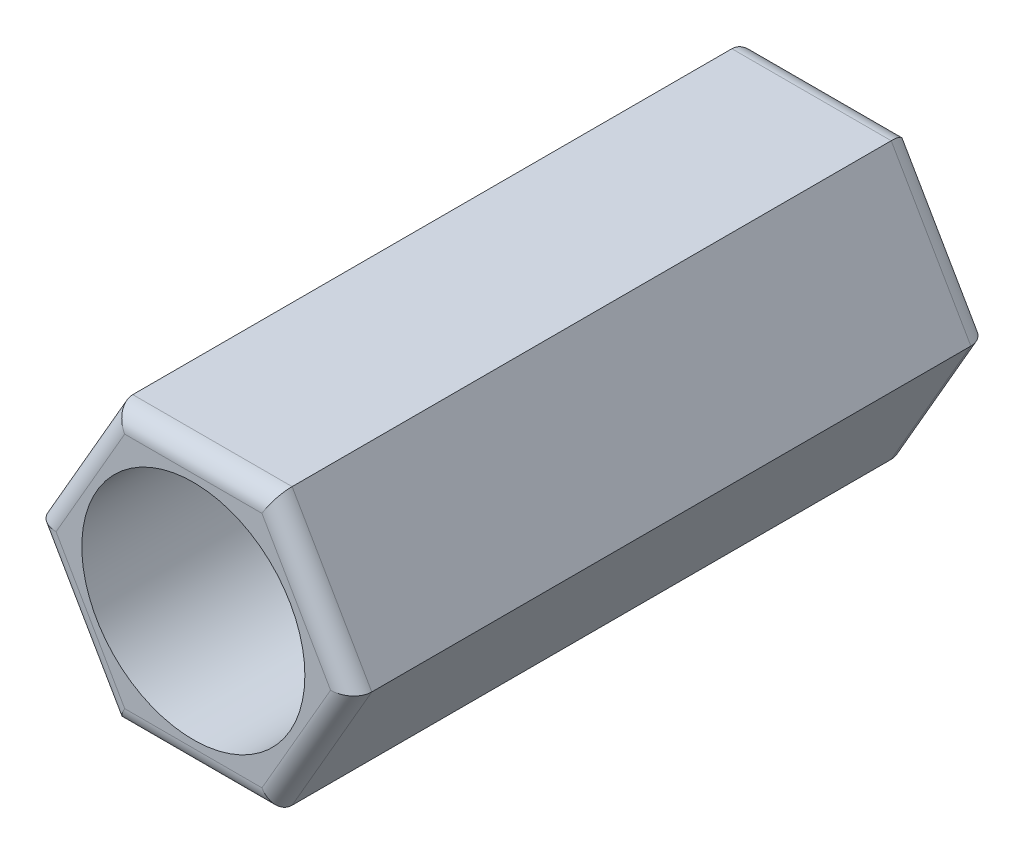
ISO-10303-21;
HEADER;
FILE_DESCRIPTION(('STEP AP214'),'2;1');
FILE_NAME('part.step','',(''),(''),'','','');
FILE_SCHEMA(('AUTOMOTIVE_DESIGN { 1 0 10303 214 1 1 1 1 }'));
ENDSEC;
DATA;
#1=APPLICATION_CONTEXT('core data for automotive mechanical design processes');
#2=APPLICATION_PROTOCOL_DEFINITION('international standard','automotive_design',2000,#1);
#3=PRODUCT_CONTEXT('',#1,'mechanical');
#4=PRODUCT('Part','Part','',(#3));
#5=PRODUCT_RELATED_PRODUCT_CATEGORY('part','',(#4));
#6=PRODUCT_DEFINITION_FORMATION('','',#4);
#7=PRODUCT_DEFINITION_CONTEXT('part definition',#1,'design');
#8=PRODUCT_DEFINITION('design','',#6,#7);
#9=PRODUCT_DEFINITION_SHAPE('','',#8);
#10=(LENGTH_UNIT() NAMED_UNIT(*) SI_UNIT(.MILLI.,.METRE.));
#11=(NAMED_UNIT(*) PLANE_ANGLE_UNIT() SI_UNIT($,.RADIAN.));
#12=(NAMED_UNIT(*) SI_UNIT($,.STERADIAN.) SOLID_ANGLE_UNIT());
#13=UNCERTAINTY_MEASURE_WITH_UNIT(LENGTH_MEASURE(1.E-05),#10,'distance_accuracy_value','');
#14=(GEOMETRIC_REPRESENTATION_CONTEXT(3) GLOBAL_UNCERTAINTY_ASSIGNED_CONTEXT((#13)) GLOBAL_UNIT_ASSIGNED_CONTEXT((#10,
#11,#12)) REPRESENTATION_CONTEXT('',''));
#15=CARTESIAN_POINT('',(0.,0.,0.));
#16=DIRECTION('',(0.,0.,1.));
#17=DIRECTION('',(1.,0.,0.));
#18=AXIS2_PLACEMENT_3D('',#15,#16,#17);
#19=CARTESIAN_POINT('',(0.,0.,10.));
#20=DIRECTION('',(0.,0.,1.));
#21=DIRECTION('',(1.,0.,0.));
#22=AXIS2_PLACEMENT_3D('',#19,#20,#21);
#23=PLANE('',#22);
#24=DIRECTION('',(1.,0.,0.));
#25=VECTOR('',#24,1.);
#26=CARTESIAN_POINT('',(1.25,-1.8650635094611,10.));
#27=LINE('',#26,#25);
#28=CARTESIAN_POINT('',(-1.07679491924311,-1.8650635094611,10.));
#29=VERTEX_POINT('',#28);
#30=CARTESIAN_POINT('',(1.07679491924311,-1.8650635094611,10.));
#31=VERTEX_POINT('',#30);
#32=EDGE_CURVE('E131',#29,#31,#27,.T.);
#33=ORIENTED_EDGE('',*,*,#32,.T.);
#34=DIRECTION('',(0.5,0.866025403784439,0.));
#35=VECTOR('',#34,1.);
#36=CARTESIAN_POINT('',(2.24019237886467,0.150000000000001,10.));
#37=LINE('',#36,#35);
#38=CARTESIAN_POINT('',(2.15358983848622,0.,10.));
#39=VERTEX_POINT('',#38);
#40=EDGE_CURVE('E163',#31,#39,#37,.T.);
#41=ORIENTED_EDGE('',*,*,#40,.T.);
#42=DIRECTION('',(-0.5,0.866025403784438,0.));
#43=VECTOR('',#42,1.);
#44=CARTESIAN_POINT('',(0.990192378864667,2.0150635094611,10.));
#45=LINE('',#44,#43);
#46=CARTESIAN_POINT('',(1.07679491924311,1.8650635094611,10.));
#47=VERTEX_POINT('',#46);
#48=EDGE_CURVE('E161',#39,#47,#45,.T.);
#49=ORIENTED_EDGE('',*,*,#48,.T.);
#50=DIRECTION('',(-1.,0.,0.));
#51=VECTOR('',#50,1.);
#52=CARTESIAN_POINT('',(-1.25,1.8650635094611,10.));
#53=LINE('',#52,#51);
#54=CARTESIAN_POINT('',(-1.07679491924311,1.8650635094611,10.));
#55=VERTEX_POINT('',#54);
#56=EDGE_CURVE('E159',#47,#55,#53,.T.);
#57=ORIENTED_EDGE('',*,*,#56,.T.);
#58=DIRECTION('',(-0.5,-0.866025403784439,0.));
#59=VECTOR('',#58,1.);
#60=CARTESIAN_POINT('',(-2.24019237886467,-0.15,10.));
#61=LINE('',#60,#59);
#62=CARTESIAN_POINT('',(-2.15358983848623,0.,10.));
#63=VERTEX_POINT('',#62);
#64=EDGE_CURVE('E134',#55,#63,#61,.T.);
#65=ORIENTED_EDGE('',*,*,#64,.T.);
#66=DIRECTION('',(0.5,-0.866025403784439,0.));
#67=VECTOR('',#66,1.);
#68=CARTESIAN_POINT('',(-0.990192378864668,-2.0150635094611,10.));
#69=LINE('',#68,#67);
#70=EDGE_CURVE('E126',#63,#29,#69,.T.);
#71=ORIENTED_EDGE('',*,*,#70,.T.);
#72=EDGE_LOOP('',(#33,#41,#49,#57,#65,#71));
#73=FACE_BOUND('',#72,.T.);
#74=CARTESIAN_POINT('',(0.,0.,10.));
#75=DIRECTION('',(0.,0.,1.));
#76=DIRECTION('',(1.,0.,0.));
#77=AXIS2_PLACEMENT_3D('',#74,#75,#76);
#78=CIRCLE('',#77,1.75);
#79=CARTESIAN_POINT('',(1.75,0.,10.));
#80=VERTEX_POINT('',#79);
#81=EDGE_CURVE('E259',#80,#80,#78,.T.);
#82=ORIENTED_EDGE('',*,*,#81,.F.);
#83=EDGE_LOOP('',(#82));
#84=FACE_BOUND('',#83,.T.);
#85=ADVANCED_FACE('F35',(#73,#84),#23,.T.);
#86=CARTESIAN_POINT('',(0.,0.,0.));
#87=DIRECTION('',(0.,0.,1.));
#88=DIRECTION('',(1.,0.,0.));
#89=AXIS2_PLACEMENT_3D('',#86,#87,#88);
#90=PLANE('',#89);
#91=DIRECTION('',(1.,0.,0.));
#92=VECTOR('',#91,1.);
#93=CARTESIAN_POINT('',(0.,-1.8650635094611,0.));
#94=LINE('',#93,#92);
#95=CARTESIAN_POINT('',(1.07679491924311,-1.8650635094611,0.));
#96=VERTEX_POINT('',#95);
#97=CARTESIAN_POINT('',(-1.07679491924311,-1.8650635094611,0.));
#98=VERTEX_POINT('',#97);
#99=EDGE_CURVE('E194',#96,#98,#94,.F.);
#100=ORIENTED_EDGE('',*,*,#99,.T.);
#101=DIRECTION('',(0.5,-0.866025403784439,0.));
#102=VECTOR('',#101,1.);
#103=CARTESIAN_POINT('',(-1.61519237886467,-0.932531754730549,0.));
#104=LINE('',#103,#102);
#105=CARTESIAN_POINT('',(-2.15358983848623,0.,0.));
#106=VERTEX_POINT('',#105);
#107=EDGE_CURVE('E201',#98,#106,#104,.F.);
#108=ORIENTED_EDGE('',*,*,#107,.T.);
#109=DIRECTION('',(-0.5,-0.866025403784439,0.));
#110=VECTOR('',#109,1.);
#111=CARTESIAN_POINT('',(-1.61519237886467,0.932531754730548,0.));
#112=LINE('',#111,#110);
#113=CARTESIAN_POINT('',(-1.07679491924311,1.8650635094611,0.));
#114=VERTEX_POINT('',#113);
#115=EDGE_CURVE('E199',#106,#114,#112,.F.);
#116=ORIENTED_EDGE('',*,*,#115,.T.);
#117=DIRECTION('',(-1.,0.,0.));
#118=VECTOR('',#117,1.);
#119=CARTESIAN_POINT('',(0.,1.8650635094611,0.));
#120=LINE('',#119,#118);
#121=CARTESIAN_POINT('',(1.07679491924311,1.8650635094611,0.));
#122=VERTEX_POINT('',#121);
#123=EDGE_CURVE('E197',#114,#122,#120,.F.);
#124=ORIENTED_EDGE('',*,*,#123,.T.);
#125=DIRECTION('',(-0.5,0.866025403784438,0.));
#126=VECTOR('',#125,1.);
#127=CARTESIAN_POINT('',(1.61519237886467,0.932531754730549,0.));
#128=LINE('',#127,#126);
#129=CARTESIAN_POINT('',(2.15358983848622,0.,0.));
#130=VERTEX_POINT('',#129);
#131=EDGE_CURVE('E192',#122,#130,#128,.F.);
#132=ORIENTED_EDGE('',*,*,#131,.T.);
#133=DIRECTION('',(0.5,0.866025403784439,0.));
#134=VECTOR('',#133,1.);
#135=CARTESIAN_POINT('',(1.61519237886467,-0.932531754730547,0.));
#136=LINE('',#135,#134);
#137=EDGE_CURVE('E190',#130,#96,#136,.F.);
#138=ORIENTED_EDGE('',*,*,#137,.T.);
#139=EDGE_LOOP('',(#100,#108,#116,#124,#132,#138));
#140=FACE_BOUND('',#139,.T.);
#141=CARTESIAN_POINT('',(0.,0.,0.));
#142=DIRECTION('',(0.,0.,1.));
#143=DIRECTION('',(1.,0.,0.));
#144=AXIS2_PLACEMENT_3D('',#141,#142,#143);
#145=CIRCLE('',#144,1.75);
#146=CARTESIAN_POINT('',(1.75,0.,0.));
#147=VERTEX_POINT('',#146);
#148=EDGE_CURVE('E187',#147,#147,#145,.T.);
#149=ORIENTED_EDGE('',*,*,#148,.T.);
#150=EDGE_LOOP('',(#149));
#151=FACE_BOUND('',#150,.T.);
#152=ADVANCED_FACE('F234',(#140,#151),#90,.F.);
#153=CARTESIAN_POINT('',(1.25,-2.1650635094611,10.));
#154=DIRECTION('',(-0.866025403784439,0.5,0.));
#155=DIRECTION('',(-0.5,-0.866025403784439,0.));
#156=AXIS2_PLACEMENT_3D('',#153,#154,#155);
#157=PLANE('',#156);
#158=DIRECTION('',(0.,0.,-1.));
#159=VECTOR('',#158,1.);
#160=CARTESIAN_POINT('',(1.25,-2.1650635094611,10.));
#161=LINE('',#160,#159);
#162=CARTESIAN_POINT('',(1.25,-2.1650635094611,9.7));
#163=VERTEX_POINT('',#162);
#164=CARTESIAN_POINT('',(1.25,-2.1650635094611,0.3));
#165=VERTEX_POINT('',#164);
#166=EDGE_CURVE('E255',#163,#165,#161,.T.);
#167=ORIENTED_EDGE('',*,*,#166,.T.);
#168=DIRECTION('',(0.5,0.866025403784439,0.));
#169=VECTOR('',#168,1.);
#170=CARTESIAN_POINT('',(1.25,-2.1650635094611,0.3));
#171=LINE('',#170,#169);
#172=CARTESIAN_POINT('',(2.5,0.,0.300000000000002));
#173=VERTEX_POINT('',#172);
#174=EDGE_CURVE('E11',#165,#173,#171,.T.);
#175=ORIENTED_EDGE('',*,*,#174,.T.);
#176=DIRECTION('',(0.,0.,-1.));
#177=VECTOR('',#176,1.);
#178=CARTESIAN_POINT('',(2.5,0.,10.));
#179=LINE('',#178,#177);
#180=CARTESIAN_POINT('',(2.5,0.,9.7));
#181=VERTEX_POINT('',#180);
#182=EDGE_CURVE('E152',#181,#173,#179,.T.);
#183=ORIENTED_EDGE('',*,*,#182,.F.);
#184=DIRECTION('',(0.5,0.866025403784439,0.));
#185=VECTOR('',#184,1.);
#186=CARTESIAN_POINT('',(1.25,-2.1650635094611,9.7));
#187=LINE('',#186,#185);
#188=EDGE_CURVE('E165',#181,#163,#187,.F.);
#189=ORIENTED_EDGE('',*,*,#188,.T.);
#190=EDGE_LOOP('',(#167,#175,#183,#189));
#191=FACE_BOUND('',#190,.T.);
#192=ADVANCED_FACE('F281',(#191),#157,.F.);
#193=CARTESIAN_POINT('',(2.5,0.,10.));
#194=DIRECTION('',(-0.866025403784438,-0.5,0.));
#195=DIRECTION('',(0.5,-0.866025403784438,0.));
#196=AXIS2_PLACEMENT_3D('',#193,#194,#195);
#197=PLANE('',#196);
#198=ORIENTED_EDGE('',*,*,#182,.T.);
#199=DIRECTION('',(-0.5,0.866025403784438,0.));
#200=VECTOR('',#199,1.);
#201=CARTESIAN_POINT('',(2.5,0.,0.3));
#202=LINE('',#201,#200);
#203=CARTESIAN_POINT('',(1.25,2.1650635094611,0.3));
#204=VERTEX_POINT('',#203);
#205=EDGE_CURVE('E57',#173,#204,#202,.T.);
#206=ORIENTED_EDGE('',*,*,#205,.T.);
#207=DIRECTION('',(0.,0.,-1.));
#208=VECTOR('',#207,1.);
#209=CARTESIAN_POINT('',(1.25,2.1650635094611,10.));
#210=LINE('',#209,#208);
#211=CARTESIAN_POINT('',(1.25,2.1650635094611,9.7));
#212=VERTEX_POINT('',#211);
#213=EDGE_CURVE('E154',#212,#204,#210,.T.);
#214=ORIENTED_EDGE('',*,*,#213,.F.);
#215=DIRECTION('',(-0.5,0.866025403784438,0.));
#216=VECTOR('',#215,1.);
#217=CARTESIAN_POINT('',(2.5,0.,9.7));
#218=LINE('',#217,#216);
#219=EDGE_CURVE('E168',#212,#181,#218,.F.);
#220=ORIENTED_EDGE('',*,*,#219,.T.);
#221=EDGE_LOOP('',(#198,#206,#214,#220));
#222=FACE_BOUND('',#221,.T.);
#223=ADVANCED_FACE('F269',(#222),#197,.F.);
#224=CARTESIAN_POINT('',(1.25,2.1650635094611,10.));
#225=DIRECTION('',(0.,-1.,0.));
#226=DIRECTION('',(0.,0.,-1.));
#227=AXIS2_PLACEMENT_3D('',#224,#225,#226);
#228=PLANE('',#227);
#229=ORIENTED_EDGE('',*,*,#213,.T.);
#230=DIRECTION('',(-1.,0.,0.));
#231=VECTOR('',#230,1.);
#232=CARTESIAN_POINT('',(1.25,2.1650635094611,0.3));
#233=LINE('',#232,#231);
#234=CARTESIAN_POINT('',(-1.25,2.1650635094611,0.300000000000002));
#235=VERTEX_POINT('',#234);
#236=EDGE_CURVE('E44',#204,#235,#233,.T.);
#237=ORIENTED_EDGE('',*,*,#236,.T.);
#238=DIRECTION('',(0.,0.,-1.));
#239=VECTOR('',#238,1.);
#240=CARTESIAN_POINT('',(-1.25,2.1650635094611,10.));
#241=LINE('',#240,#239);
#242=CARTESIAN_POINT('',(-1.25,2.1650635094611,9.7));
#243=VERTEX_POINT('',#242);
#244=EDGE_CURVE('E257',#243,#235,#241,.T.);
#245=ORIENTED_EDGE('',*,*,#244,.F.);
#246=DIRECTION('',(-1.,0.,0.));
#247=VECTOR('',#246,1.);
#248=CARTESIAN_POINT('',(1.25,2.1650635094611,9.7));
#249=LINE('',#248,#247);
#250=EDGE_CURVE('E170',#243,#212,#249,.F.);
#251=ORIENTED_EDGE('',*,*,#250,.T.);
#252=EDGE_LOOP('',(#229,#237,#245,#251));
#253=FACE_BOUND('',#252,.T.);
#254=ADVANCED_FACE('F265',(#253),#228,.F.);
#255=CARTESIAN_POINT('',(-1.25,2.1650635094611,10.));
#256=DIRECTION('',(0.866025403784439,-0.5,0.));
#257=DIRECTION('',(0.5,0.866025403784439,0.));
#258=AXIS2_PLACEMENT_3D('',#255,#256,#257);
#259=PLANE('',#258);
#260=ORIENTED_EDGE('',*,*,#244,.T.);
#261=DIRECTION('',(-0.5,-0.866025403784439,0.));
#262=VECTOR('',#261,1.);
#263=CARTESIAN_POINT('',(-1.25,2.1650635094611,0.3));
#264=LINE('',#263,#262);
#265=CARTESIAN_POINT('',(-2.5,0.,0.300000000000002));
#266=VERTEX_POINT('',#265);
#267=EDGE_CURVE('E205',#235,#266,#264,.T.);
#268=ORIENTED_EDGE('',*,*,#267,.T.);
#269=DIRECTION('',(0.,0.,-1.));
#270=VECTOR('',#269,1.);
#271=CARTESIAN_POINT('',(-2.5,0.,10.));
#272=LINE('',#271,#270);
#273=CARTESIAN_POINT('',(-2.5,0.,9.7));
#274=VERTEX_POINT('',#273);
#275=EDGE_CURVE('E251',#274,#266,#272,.T.);
#276=ORIENTED_EDGE('',*,*,#275,.F.);
#277=DIRECTION('',(-0.5,-0.866025403784439,0.));
#278=VECTOR('',#277,1.);
#279=CARTESIAN_POINT('',(-1.25,2.1650635094611,9.7));
#280=LINE('',#279,#278);
#281=EDGE_CURVE('E172',#274,#243,#280,.F.);
#282=ORIENTED_EDGE('',*,*,#281,.T.);
#283=EDGE_LOOP('',(#260,#268,#276,#282));
#284=FACE_BOUND('',#283,.T.);
#285=ADVANCED_FACE('F309',(#284),#259,.F.);
#286=CARTESIAN_POINT('',(-2.5,0.,10.));
#287=DIRECTION('',(0.866025403784439,0.5,0.));
#288=DIRECTION('',(-0.5,0.866025403784439,0.));
#289=AXIS2_PLACEMENT_3D('',#286,#287,#288);
#290=PLANE('',#289);
#291=ORIENTED_EDGE('',*,*,#275,.T.);
#292=DIRECTION('',(0.5,-0.866025403784439,0.));
#293=VECTOR('',#292,1.);
#294=CARTESIAN_POINT('',(-2.5,0.,0.3));
#295=LINE('',#294,#293);
#296=CARTESIAN_POINT('',(-1.25,-2.1650635094611,0.300000000000002));
#297=VERTEX_POINT('',#296);
#298=EDGE_CURVE('E203',#266,#297,#295,.T.);
#299=ORIENTED_EDGE('',*,*,#298,.T.);
#300=DIRECTION('',(0.,0.,-1.));
#301=VECTOR('',#300,1.);
#302=CARTESIAN_POINT('',(-1.25,-2.1650635094611,10.));
#303=LINE('',#302,#301);
#304=CARTESIAN_POINT('',(-1.25,-2.1650635094611,9.7));
#305=VERTEX_POINT('',#304);
#306=EDGE_CURVE('E249',#305,#297,#303,.T.);
#307=ORIENTED_EDGE('',*,*,#306,.F.);
#308=DIRECTION('',(0.5,-0.866025403784439,0.));
#309=VECTOR('',#308,1.);
#310=CARTESIAN_POINT('',(-2.5,0.,9.7));
#311=LINE('',#310,#309);
#312=EDGE_CURVE('E143',#305,#274,#311,.F.);
#313=ORIENTED_EDGE('',*,*,#312,.T.);
#314=EDGE_LOOP('',(#291,#299,#307,#313));
#315=FACE_BOUND('',#314,.T.);
#316=ADVANCED_FACE('F248',(#315),#290,.F.);
#317=CARTESIAN_POINT('',(-1.25,-2.1650635094611,10.));
#318=DIRECTION('',(0.,1.,0.));
#319=DIRECTION('',(-1.,0.,0.));
#320=AXIS2_PLACEMENT_3D('',#317,#318,#319);
#321=PLANE('',#320);
#322=ORIENTED_EDGE('',*,*,#306,.T.);
#323=DIRECTION('',(1.,0.,0.));
#324=VECTOR('',#323,1.);
#325=CARTESIAN_POINT('',(-1.25,-2.1650635094611,0.3));
#326=LINE('',#325,#324);
#327=EDGE_CURVE('E177',#297,#165,#326,.T.);
#328=ORIENTED_EDGE('',*,*,#327,.T.);
#329=ORIENTED_EDGE('',*,*,#166,.F.);
#330=DIRECTION('',(1.,0.,0.));
#331=VECTOR('',#330,1.);
#332=CARTESIAN_POINT('',(-1.25,-2.1650635094611,9.7));
#333=LINE('',#332,#331);
#334=EDGE_CURVE('E175',#163,#305,#333,.F.);
#335=ORIENTED_EDGE('',*,*,#334,.T.);
#336=EDGE_LOOP('',(#322,#328,#329,#335));
#337=FACE_BOUND('',#336,.T.);
#338=ADVANCED_FACE('F253',(#337),#321,.F.);
#339=CARTESIAN_POINT('',(0.,0.,10.));
#340=DIRECTION('',(0.,0.,-1.));
#341=DIRECTION('',(-1.,0.,0.));
#342=AXIS2_PLACEMENT_3D('',#339,#340,#341);
#343=CYLINDRICAL_SURFACE('',#342,1.75);
#344=ORIENTED_EDGE('',*,*,#81,.T.);
#345=EDGE_LOOP('',(#344));
#346=FACE_BOUND('',#345,.T.);
#347=ORIENTED_EDGE('',*,*,#148,.F.);
#348=EDGE_LOOP('',(#347));
#349=FACE_BOUND('',#348,.T.);
#350=ADVANCED_FACE('F303',(#346,#349),#343,.F.);
#351=CARTESIAN_POINT('',(-1.61519237886467,0.932531754730548,9.7));
#352=DIRECTION('',(0.5,0.866025403784439,0.));
#353=DIRECTION('',(-0.866025403784439,0.5,0.));
#354=AXIS2_PLACEMENT_3D('',#351,#352,#353);
#355=CYLINDRICAL_SURFACE('',#354,0.3);
#356=CARTESIAN_POINT('',(-1.07679491924311,1.8650635094611,9.7));
#357=DIRECTION('',(0.866025403784439,0.5,0.));
#358=DIRECTION('',(-0.5,0.866025403784439,0.));
#359=AXIS2_PLACEMENT_3D('',#356,#357,#358);
#360=ELLIPSE('',#359,0.346410161513775,0.3);
#361=EDGE_CURVE('E146',#243,#55,#360,.T.);
#362=ORIENTED_EDGE('',*,*,#361,.F.);
#363=ORIENTED_EDGE('',*,*,#281,.F.);
#364=CARTESIAN_POINT('',(-2.15358983848623,0.,9.7));
#365=DIRECTION('',(0.,1.,0.));
#366=DIRECTION('',(-1.,0.,0.));
#367=AXIS2_PLACEMENT_3D('',#364,#365,#366);
#368=ELLIPSE('',#367,0.346410161513775,0.3);
#369=EDGE_CURVE('E185',#63,#274,#368,.F.);
#370=ORIENTED_EDGE('',*,*,#369,.F.);
#371=ORIENTED_EDGE('',*,*,#64,.F.);
#372=EDGE_LOOP('',(#362,#363,#370,#371));
#373=FACE_BOUND('',#372,.T.);
#374=ADVANCED_FACE('F328',(#373),#355,.T.);
#375=CARTESIAN_POINT('',(-1.61519237886467,-0.932531754730549,9.7));
#376=DIRECTION('',(-0.5,0.866025403784439,0.));
#377=DIRECTION('',(-0.866025403784439,-0.5,0.));
#378=AXIS2_PLACEMENT_3D('',#375,#376,#377);
#379=CYLINDRICAL_SURFACE('',#378,0.3);
#380=ORIENTED_EDGE('',*,*,#369,.T.);
#381=ORIENTED_EDGE('',*,*,#312,.F.);
#382=CARTESIAN_POINT('',(-1.07679491924311,-1.8650635094611,9.7));
#383=DIRECTION('',(-0.866025403784439,0.5,0.));
#384=DIRECTION('',(-0.5,-0.866025403784439,0.));
#385=AXIS2_PLACEMENT_3D('',#382,#383,#384);
#386=ELLIPSE('',#385,0.346410161513775,0.3);
#387=EDGE_CURVE('E141',#29,#305,#386,.F.);
#388=ORIENTED_EDGE('',*,*,#387,.F.);
#389=ORIENTED_EDGE('',*,*,#70,.F.);
#390=EDGE_LOOP('',(#380,#381,#388,#389));
#391=FACE_BOUND('',#390,.T.);
#392=ADVANCED_FACE('F142',(#391),#379,.T.);
#393=CARTESIAN_POINT('',(0.,1.8650635094611,9.7));
#394=DIRECTION('',(1.,0.,0.));
#395=DIRECTION('',(0.,0.,-1.));
#396=AXIS2_PLACEMENT_3D('',#393,#394,#395);
#397=CYLINDRICAL_SURFACE('',#396,0.3);
#398=ORIENTED_EDGE('',*,*,#361,.T.);
#399=ORIENTED_EDGE('',*,*,#56,.F.);
#400=CARTESIAN_POINT('',(1.07679491924311,1.8650635094611,9.7));
#401=DIRECTION('',(0.866025403784439,-0.5,0.));
#402=DIRECTION('',(0.5,0.866025403784439,0.));
#403=AXIS2_PLACEMENT_3D('',#400,#401,#402);
#404=ELLIPSE('',#403,0.346410161513775,0.3);
#405=EDGE_CURVE('E147',#212,#47,#404,.T.);
#406=ORIENTED_EDGE('',*,*,#405,.F.);
#407=ORIENTED_EDGE('',*,*,#250,.F.);
#408=EDGE_LOOP('',(#398,#399,#406,#407));
#409=FACE_BOUND('',#408,.T.);
#410=ADVANCED_FACE('F273',(#409),#397,.T.);
#411=CARTESIAN_POINT('',(0.,-1.8650635094611,9.7));
#412=DIRECTION('',(-1.,0.,0.));
#413=DIRECTION('',(0.,-1.,0.));
#414=AXIS2_PLACEMENT_3D('',#411,#412,#413);
#415=CYLINDRICAL_SURFACE('',#414,0.3);
#416=ORIENTED_EDGE('',*,*,#387,.T.);
#417=ORIENTED_EDGE('',*,*,#334,.F.);
#418=CARTESIAN_POINT('',(1.07679491924311,-1.8650635094611,9.7));
#419=DIRECTION('',(-0.866025403784438,-0.5,0.));
#420=DIRECTION('',(-0.5,0.866025403784439,0.));
#421=AXIS2_PLACEMENT_3D('',#418,#419,#420);
#422=ELLIPSE('',#421,0.346410161513776,0.3);
#423=EDGE_CURVE('E150',#31,#163,#422,.F.);
#424=ORIENTED_EDGE('',*,*,#423,.F.);
#425=ORIENTED_EDGE('',*,*,#32,.F.);
#426=EDGE_LOOP('',(#416,#417,#424,#425));
#427=FACE_BOUND('',#426,.T.);
#428=ADVANCED_FACE('F149',(#427),#415,.T.);
#429=CARTESIAN_POINT('',(1.61519237886467,0.932531754730549,9.7));
#430=DIRECTION('',(0.5,-0.866025403784438,0.));
#431=DIRECTION('',(0.866025403784438,0.5,0.));
#432=AXIS2_PLACEMENT_3D('',#429,#430,#431);
#433=CYLINDRICAL_SURFACE('',#432,0.3);
#434=ORIENTED_EDGE('',*,*,#405,.T.);
#435=ORIENTED_EDGE('',*,*,#48,.F.);
#436=CARTESIAN_POINT('',(2.15358983848622,0.,9.7));
#437=DIRECTION('',(0.,-1.,0.));
#438=DIRECTION('',(1.,0.,0.));
#439=AXIS2_PLACEMENT_3D('',#436,#437,#438);
#440=ELLIPSE('',#439,0.346410161513775,0.3);
#441=EDGE_CURVE('E178',#181,#39,#440,.T.);
#442=ORIENTED_EDGE('',*,*,#441,.F.);
#443=ORIENTED_EDGE('',*,*,#219,.F.);
#444=EDGE_LOOP('',(#434,#435,#442,#443));
#445=FACE_BOUND('',#444,.T.);
#446=ADVANCED_FACE('F277',(#445),#433,.T.);
#447=CARTESIAN_POINT('',(1.61519237886467,-0.932531754730547,9.7));
#448=DIRECTION('',(-0.5,-0.866025403784439,0.));
#449=DIRECTION('',(0.866025403784439,-0.5,0.));
#450=AXIS2_PLACEMENT_3D('',#447,#448,#449);
#451=CYLINDRICAL_SURFACE('',#450,0.3);
#452=ORIENTED_EDGE('',*,*,#423,.T.);
#453=ORIENTED_EDGE('',*,*,#188,.F.);
#454=ORIENTED_EDGE('',*,*,#441,.T.);
#455=ORIENTED_EDGE('',*,*,#40,.F.);
#456=EDGE_LOOP('',(#452,#453,#454,#455));
#457=FACE_BOUND('',#456,.T.);
#458=ADVANCED_FACE('F280',(#457),#451,.T.);
#459=CARTESIAN_POINT('',(1.25,1.8650635094611,0.3));
#460=DIRECTION('',(-1.,0.,0.));
#461=DIRECTION('',(0.,0.,1.));
#462=AXIS2_PLACEMENT_3D('',#459,#460,#461);
#463=CYLINDRICAL_SURFACE('',#462,0.3);
#464=CARTESIAN_POINT('',(1.07679491924311,1.8650635094611,0.3));
#465=DIRECTION('',(-0.866025403784439,0.5,0.));
#466=DIRECTION('',(-0.5,-0.866025403784439,0.));
#467=AXIS2_PLACEMENT_3D('',#464,#465,#466);
#468=ELLIPSE('',#467,0.346410161513775,0.3);
#469=EDGE_CURVE('E218',#122,#204,#468,.F.);
#470=ORIENTED_EDGE('',*,*,#469,.F.);
#471=ORIENTED_EDGE('',*,*,#123,.F.);
#472=CARTESIAN_POINT('',(-1.07679491924311,1.8650635094611,0.3));
#473=DIRECTION('',(-0.866025403784439,-0.5,0.));
#474=DIRECTION('',(-0.5,0.866025403784439,0.));
#475=AXIS2_PLACEMENT_3D('',#472,#473,#474);
#476=ELLIPSE('',#475,0.346410161513775,0.3);
#477=EDGE_CURVE('E39',#235,#114,#476,.T.);
#478=ORIENTED_EDGE('',*,*,#477,.F.);
#479=ORIENTED_EDGE('',*,*,#236,.F.);
#480=EDGE_LOOP('',(#470,#471,#478,#479));
#481=FACE_BOUND('',#480,.T.);
#482=ADVANCED_FACE('F37',(#481),#463,.T.);
#483=CARTESIAN_POINT('',(-0.990192378864669,2.0150635094611,0.3));
#484=DIRECTION('',(-0.5,-0.866025403784439,0.));
#485=DIRECTION('',(0.866025403784439,-0.5,0.));
#486=AXIS2_PLACEMENT_3D('',#483,#484,#485);
#487=CYLINDRICAL_SURFACE('',#486,0.3);
#488=ORIENTED_EDGE('',*,*,#477,.T.);
#489=ORIENTED_EDGE('',*,*,#115,.F.);
#490=CARTESIAN_POINT('',(-2.15358983848623,0.,0.3));
#491=DIRECTION('',(0.,-1.,0.));
#492=DIRECTION('',(-1.,0.,0.));
#493=AXIS2_PLACEMENT_3D('',#490,#491,#492);
#494=ELLIPSE('',#493,0.346410161513775,0.3);
#495=EDGE_CURVE('E216',#266,#106,#494,.T.);
#496=ORIENTED_EDGE('',*,*,#495,.F.);
#497=ORIENTED_EDGE('',*,*,#267,.F.);
#498=EDGE_LOOP('',(#488,#489,#496,#497));
#499=FACE_BOUND('',#498,.T.);
#500=ADVANCED_FACE('F228',(#499),#487,.T.);
#501=CARTESIAN_POINT('',(2.24019237886467,-0.149999999999999,0.3));
#502=DIRECTION('',(-0.5,0.866025403784438,0.));
#503=DIRECTION('',(-0.866025403784438,-0.5,0.));
#504=AXIS2_PLACEMENT_3D('',#501,#502,#503);
#505=CYLINDRICAL_SURFACE('',#504,0.3);
#506=ORIENTED_EDGE('',*,*,#469,.T.);
#507=ORIENTED_EDGE('',*,*,#205,.F.);
#508=CARTESIAN_POINT('',(2.15358983848622,0.,0.3));
#509=DIRECTION('',(0.,1.,0.));
#510=DIRECTION('',(1.,0.,0.));
#511=AXIS2_PLACEMENT_3D('',#508,#509,#510);
#512=ELLIPSE('',#511,0.346410161513775,0.3);
#513=EDGE_CURVE('E213',#130,#173,#512,.F.);
#514=ORIENTED_EDGE('',*,*,#513,.F.);
#515=ORIENTED_EDGE('',*,*,#131,.F.);
#516=EDGE_LOOP('',(#506,#507,#514,#515));
#517=FACE_BOUND('',#516,.T.);
#518=ADVANCED_FACE('F282',(#517),#505,.T.);
#519=CARTESIAN_POINT('',(-2.24019237886467,0.15,0.3));
#520=DIRECTION('',(0.5,-0.866025403784439,0.));
#521=DIRECTION('',(0.866025403784439,0.5,0.));
#522=AXIS2_PLACEMENT_3D('',#519,#520,#521);
#523=CYLINDRICAL_SURFACE('',#522,0.3);
#524=ORIENTED_EDGE('',*,*,#495,.T.);
#525=ORIENTED_EDGE('',*,*,#107,.F.);
#526=CARTESIAN_POINT('',(-1.07679491924311,-1.8650635094611,0.3));
#527=DIRECTION('',(0.866025403784439,-0.5,0.));
#528=DIRECTION('',(-0.5,-0.866025403784439,0.));
#529=AXIS2_PLACEMENT_3D('',#526,#527,#528);
#530=ELLIPSE('',#529,0.346410161513775,0.3);
#531=EDGE_CURVE('E211',#297,#98,#530,.T.);
#532=ORIENTED_EDGE('',*,*,#531,.F.);
#533=ORIENTED_EDGE('',*,*,#298,.F.);
#534=EDGE_LOOP('',(#524,#525,#532,#533));
#535=FACE_BOUND('',#534,.T.);
#536=ADVANCED_FACE('F241',(#535),#523,.T.);
#537=CARTESIAN_POINT('',(0.990192378864668,-2.0150635094611,0.3));
#538=DIRECTION('',(0.5,0.866025403784439,0.));
#539=DIRECTION('',(-0.866025403784439,0.5,0.));
#540=AXIS2_PLACEMENT_3D('',#537,#538,#539);
#541=CYLINDRICAL_SURFACE('',#540,0.3);
#542=ORIENTED_EDGE('',*,*,#513,.T.);
#543=ORIENTED_EDGE('',*,*,#174,.F.);
#544=CARTESIAN_POINT('',(1.07679491924311,-1.8650635094611,0.3));
#545=DIRECTION('',(0.866025403784438,0.5,0.));
#546=DIRECTION('',(-0.5,0.866025403784439,0.));
#547=AXIS2_PLACEMENT_3D('',#544,#545,#546);
#548=ELLIPSE('',#547,0.346410161513776,0.3);
#549=EDGE_CURVE('E209',#96,#165,#548,.F.);
#550=ORIENTED_EDGE('',*,*,#549,.F.);
#551=ORIENTED_EDGE('',*,*,#137,.F.);
#552=EDGE_LOOP('',(#542,#543,#550,#551));
#553=FACE_BOUND('',#552,.T.);
#554=ADVANCED_FACE('F285',(#553),#541,.T.);
#555=CARTESIAN_POINT('',(-1.25,-1.8650635094611,0.3));
#556=DIRECTION('',(1.,0.,0.));
#557=DIRECTION('',(0.,1.,0.));
#558=AXIS2_PLACEMENT_3D('',#555,#556,#557);
#559=CYLINDRICAL_SURFACE('',#558,0.3);
#560=ORIENTED_EDGE('',*,*,#531,.T.);
#561=ORIENTED_EDGE('',*,*,#99,.F.);
#562=ORIENTED_EDGE('',*,*,#549,.T.);
#563=ORIENTED_EDGE('',*,*,#327,.F.);
#564=EDGE_LOOP('',(#560,#561,#562,#563));
#565=FACE_BOUND('',#564,.T.);
#566=ADVANCED_FACE('F288',(#565),#559,.T.);
#567=CLOSED_SHELL('',(#85,#152,#192,#223,#254,#285,#316,#338,#350,#374,#392,#410,#428,#446,#458,
#482,#500,#518,#536,#554,#566));
#568=MANIFOLD_SOLID_BREP('B2',#567);
#569=ADVANCED_BREP_SHAPE_REPRESENTATION('',(#18,#568),#14);
#570=SHAPE_DEFINITION_REPRESENTATION(#9,#569);
ENDSEC;
END-ISO-10303-21;
